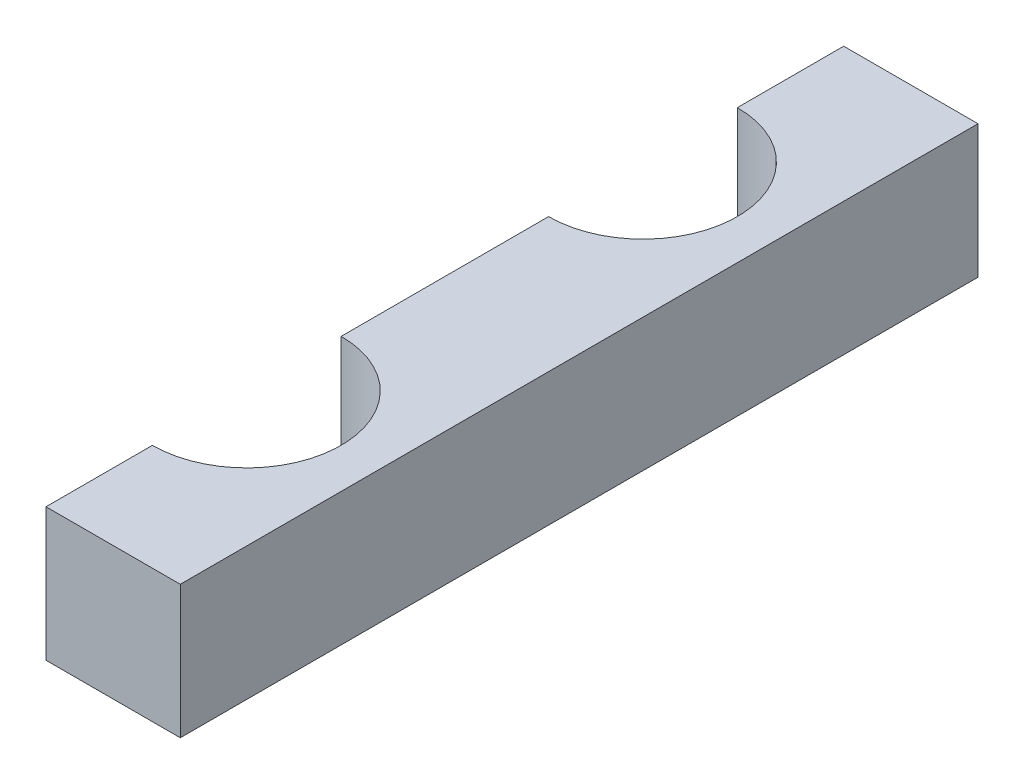
ISO-10303-21;
HEADER;
FILE_DESCRIPTION(('STEP AP214'),'2;1');
FILE_NAME('part.step','',(''),(''),'','','');
FILE_SCHEMA(('AUTOMOTIVE_DESIGN { 1 0 10303 214 1 1 1 1 }'));
ENDSEC;
DATA;
#1=APPLICATION_CONTEXT('core data for automotive mechanical design processes');
#2=APPLICATION_PROTOCOL_DEFINITION('international standard','automotive_design',2000,#1);
#3=PRODUCT_CONTEXT('',#1,'mechanical');
#4=PRODUCT('Part','Part','',(#3));
#5=PRODUCT_RELATED_PRODUCT_CATEGORY('part','',(#4));
#6=PRODUCT_DEFINITION_FORMATION('','',#4);
#7=PRODUCT_DEFINITION_CONTEXT('part definition',#1,'design');
#8=PRODUCT_DEFINITION('design','',#6,#7);
#9=PRODUCT_DEFINITION_SHAPE('','',#8);
#10=(LENGTH_UNIT() NAMED_UNIT(*) SI_UNIT(.MILLI.,.METRE.));
#11=(NAMED_UNIT(*) PLANE_ANGLE_UNIT() SI_UNIT($,.RADIAN.));
#12=(NAMED_UNIT(*) SI_UNIT($,.STERADIAN.) SOLID_ANGLE_UNIT());
#13=UNCERTAINTY_MEASURE_WITH_UNIT(LENGTH_MEASURE(1.E-05),#10,'distance_accuracy_value','');
#14=(GEOMETRIC_REPRESENTATION_CONTEXT(3) GLOBAL_UNCERTAINTY_ASSIGNED_CONTEXT((#13)) GLOBAL_UNIT_ASSIGNED_CONTEXT((#10,
#11,#12)) REPRESENTATION_CONTEXT('',''));
#15=CARTESIAN_POINT('',(0.,0.,0.));
#16=DIRECTION('',(0.,0.,1.));
#17=DIRECTION('',(1.,0.,0.));
#18=AXIS2_PLACEMENT_3D('',#15,#16,#17);
#19=CARTESIAN_POINT('',(3.56584894283638,372.645061039175,-110.773881836316));
#20=DIRECTION('',(0.,0.,-1.));
#21=DIRECTION('',(-1.,0.,0.));
#22=AXIS2_PLACEMENT_3D('',#19,#20,#21);
#23=PLANE('',#22);
#24=DIRECTION('',(-1.,0.,0.));
#25=VECTOR('',#24,1.);
#26=CARTESIAN_POINT('',(3.56584894283638,382.645061039175,-110.773881836316));
#27=LINE('',#26,#25);
#28=CARTESIAN_POINT('',(13.6658489428364,382.645061039175,-110.773881836316));
#29=VERTEX_POINT('',#28);
#30=CARTESIAN_POINT('',(3.56584894283638,382.645061039175,-110.773881836316));
#31=VERTEX_POINT('',#30);
#32=EDGE_CURVE('E131',#29,#31,#27,.T.);
#33=ORIENTED_EDGE('',*,*,#32,.F.);
#34=DIRECTION('',(0.,1.,0.));
#35=VECTOR('',#34,1.);
#36=CARTESIAN_POINT('',(13.6658489428364,372.645061039175,-110.773881836316));
#37=LINE('',#36,#35);
#38=CARTESIAN_POINT('',(13.6658489428364,372.645061039175,-110.773881836316));
#39=VERTEX_POINT('',#38);
#40=EDGE_CURVE('E11',#39,#29,#37,.T.);
#41=ORIENTED_EDGE('',*,*,#40,.F.);
#42=DIRECTION('',(-1.,0.,0.));
#43=VECTOR('',#42,1.);
#44=CARTESIAN_POINT('',(3.56584894283638,372.645061039175,-110.773881836316));
#45=LINE('',#44,#43);
#46=CARTESIAN_POINT('',(3.56584894283638,372.645061039175,-110.773881836316));
#47=VERTEX_POINT('',#46);
#48=EDGE_CURVE('E151',#39,#47,#45,.T.);
#49=ORIENTED_EDGE('',*,*,#48,.T.);
#50=DIRECTION('',(0.,1.,0.));
#51=VECTOR('',#50,1.);
#52=CARTESIAN_POINT('',(3.56584894283638,372.645061039175,-110.773881836316));
#53=LINE('',#52,#51);
#54=EDGE_CURVE('E37',#47,#31,#53,.T.);
#55=ORIENTED_EDGE('',*,*,#54,.T.);
#56=EDGE_LOOP('',(#33,#41,#49,#55));
#57=FACE_BOUND('',#56,.T.);
#58=ADVANCED_FACE('F34',(#57),#23,.T.);
#59=CARTESIAN_POINT('',(13.6658489428364,372.645061039175,-110.773881836316));
#60=DIRECTION('',(1.,0.,0.));
#61=DIRECTION('',(0.,0.,-1.));
#62=AXIS2_PLACEMENT_3D('',#59,#60,#61);
#63=PLANE('',#62);
#64=DIRECTION('',(0.,0.,-1.));
#65=VECTOR('',#64,1.);
#66=CARTESIAN_POINT('',(13.6658489428364,382.645061039175,-110.773881836316));
#67=LINE('',#66,#65);
#68=CARTESIAN_POINT('',(13.6658489428364,382.645061039175,-50.7738818363162));
#69=VERTEX_POINT('',#68);
#70=EDGE_CURVE('E149',#69,#29,#67,.T.);
#71=ORIENTED_EDGE('',*,*,#70,.F.);
#72=DIRECTION('',(0.,1.,0.));
#73=VECTOR('',#72,1.);
#74=CARTESIAN_POINT('',(13.6658489428364,372.645061039175,-50.7738818363162));
#75=LINE('',#74,#73);
#76=CARTESIAN_POINT('',(13.6658489428364,372.645061039175,-50.7738818363162));
#77=VERTEX_POINT('',#76);
#78=EDGE_CURVE('E43',#77,#69,#75,.T.);
#79=ORIENTED_EDGE('',*,*,#78,.F.);
#80=DIRECTION('',(0.,0.,-1.));
#81=VECTOR('',#80,1.);
#82=CARTESIAN_POINT('',(13.6658489428364,372.645061039175,-110.773881836316));
#83=LINE('',#82,#81);
#84=EDGE_CURVE('E121',#77,#39,#83,.T.);
#85=ORIENTED_EDGE('',*,*,#84,.T.);
#86=ORIENTED_EDGE('',*,*,#40,.T.);
#87=EDGE_LOOP('',(#71,#79,#85,#86));
#88=FACE_BOUND('',#87,.T.);
#89=ADVANCED_FACE('F163',(#88),#63,.T.);
#90=CARTESIAN_POINT('',(3.56584894283638,372.645061039175,-50.7738818363162));
#91=DIRECTION('',(0.,0.,1.));
#92=DIRECTION('',(1.,0.,0.));
#93=AXIS2_PLACEMENT_3D('',#90,#91,#92);
#94=PLANE('',#93);
#95=DIRECTION('',(1.,0.,0.));
#96=VECTOR('',#95,1.);
#97=CARTESIAN_POINT('',(3.56584894283638,382.645061039175,-50.7738818363162));
#98=LINE('',#97,#96);
#99=CARTESIAN_POINT('',(3.56584894283638,382.645061039175,-50.7738818363162));
#100=VERTEX_POINT('',#99);
#101=EDGE_CURVE('E108',#100,#69,#98,.T.);
#102=ORIENTED_EDGE('',*,*,#101,.F.);
#103=DIRECTION('',(0.,1.,0.));
#104=VECTOR('',#103,1.);
#105=CARTESIAN_POINT('',(3.56584894283638,372.645061039175,-50.7738818363162));
#106=LINE('',#105,#104);
#107=CARTESIAN_POINT('',(3.56584894283638,372.645061039175,-50.7738818363162));
#108=VERTEX_POINT('',#107);
#109=EDGE_CURVE('E103',#108,#100,#106,.T.);
#110=ORIENTED_EDGE('',*,*,#109,.F.);
#111=DIRECTION('',(1.,0.,0.));
#112=VECTOR('',#111,1.);
#113=CARTESIAN_POINT('',(3.56584894283638,372.645061039175,-50.7738818363162));
#114=LINE('',#113,#112);
#115=EDGE_CURVE('E106',#108,#77,#114,.T.);
#116=ORIENTED_EDGE('',*,*,#115,.T.);
#117=ORIENTED_EDGE('',*,*,#78,.T.);
#118=EDGE_LOOP('',(#102,#110,#116,#117));
#119=FACE_BOUND('',#118,.T.);
#120=ADVANCED_FACE('F105',(#119),#94,.T.);
#121=CARTESIAN_POINT('',(3.56584894283638,372.645061039175,-58.7738818363162));
#122=DIRECTION('',(-1.,0.,0.));
#123=DIRECTION('',(0.,0.,1.));
#124=AXIS2_PLACEMENT_3D('',#121,#122,#123);
#125=PLANE('',#124);
#126=DIRECTION('',(0.,0.,1.));
#127=VECTOR('',#126,1.);
#128=CARTESIAN_POINT('',(3.56584894283638,382.645061039175,-58.7738818363162));
#129=LINE('',#128,#127);
#130=CARTESIAN_POINT('',(3.56584894283638,382.645061039175,-58.7738818363162));
#131=VERTEX_POINT('',#130);
#132=EDGE_CURVE('E146',#131,#100,#129,.T.);
#133=ORIENTED_EDGE('',*,*,#132,.F.);
#134=DIRECTION('',(0.,1.,0.));
#135=VECTOR('',#134,1.);
#136=CARTESIAN_POINT('',(3.56584894283638,372.645061039175,-58.7738818363162));
#137=LINE('',#136,#135);
#138=CARTESIAN_POINT('',(3.56584894283638,372.645061039175,-58.7738818363162));
#139=VERTEX_POINT('',#138);
#140=EDGE_CURVE('E113',#139,#131,#137,.T.);
#141=ORIENTED_EDGE('',*,*,#140,.F.);
#142=DIRECTION('',(0.,0.,1.));
#143=VECTOR('',#142,1.);
#144=CARTESIAN_POINT('',(3.56584894283638,372.645061039175,-58.7738818363162));
#145=LINE('',#144,#143);
#146=EDGE_CURVE('E119',#139,#108,#145,.T.);
#147=ORIENTED_EDGE('',*,*,#146,.T.);
#148=ORIENTED_EDGE('',*,*,#109,.T.);
#149=EDGE_LOOP('',(#133,#141,#147,#148));
#150=FACE_BOUND('',#149,.T.);
#151=ADVANCED_FACE('F123',(#150),#125,.T.);
#152=CARTESIAN_POINT('',(3.56584894283638,372.645061039175,-65.8738818363162));
#153=DIRECTION('',(0.,1.,0.));
#154=DIRECTION('',(0.,0.,1.));
#155=AXIS2_PLACEMENT_3D('',#152,#153,#154);
#156=CYLINDRICAL_SURFACE('',#155,7.1);
#157=CARTESIAN_POINT('',(3.56584894283638,382.645061039175,-65.8738818363162));
#158=DIRECTION('',(0.,-1.,0.));
#159=DIRECTION('',(0.,0.,-1.));
#160=AXIS2_PLACEMENT_3D('',#157,#158,#159);
#161=CIRCLE('',#160,7.1);
#162=CARTESIAN_POINT('',(3.56584894283638,382.645061039175,-72.9738818363162));
#163=VERTEX_POINT('',#162);
#164=EDGE_CURVE('E143',#163,#131,#161,.T.);
#165=ORIENTED_EDGE('',*,*,#164,.F.);
#166=DIRECTION('',(0.,1.,0.));
#167=VECTOR('',#166,1.);
#168=CARTESIAN_POINT('',(3.56584894283638,372.645061039175,-72.9738818363162));
#169=LINE('',#168,#167);
#170=CARTESIAN_POINT('',(3.56584894283638,372.645061039175,-72.9738818363162));
#171=VERTEX_POINT('',#170);
#172=EDGE_CURVE('E155',#171,#163,#169,.T.);
#173=ORIENTED_EDGE('',*,*,#172,.F.);
#174=CARTESIAN_POINT('',(3.56584894283638,372.645061039175,-65.8738818363162));
#175=DIRECTION('',(0.,-1.,0.));
#176=DIRECTION('',(0.,0.,-1.));
#177=AXIS2_PLACEMENT_3D('',#174,#175,#176);
#178=CIRCLE('',#177,7.1);
#179=EDGE_CURVE('E124',#171,#139,#178,.T.);
#180=ORIENTED_EDGE('',*,*,#179,.T.);
#181=ORIENTED_EDGE('',*,*,#140,.T.);
#182=EDGE_LOOP('',(#165,#173,#180,#181));
#183=FACE_BOUND('',#182,.T.);
#184=ADVANCED_FACE('F176',(#183),#156,.F.);
#185=CARTESIAN_POINT('',(3.56584894283638,372.645061039175,-88.5738818363162));
#186=DIRECTION('',(-1.,0.,0.));
#187=DIRECTION('',(0.,0.,1.));
#188=AXIS2_PLACEMENT_3D('',#185,#186,#187);
#189=PLANE('',#188);
#190=DIRECTION('',(0.,0.,1.));
#191=VECTOR('',#190,1.);
#192=CARTESIAN_POINT('',(3.56584894283638,382.645061039175,-88.5738818363162));
#193=LINE('',#192,#191);
#194=CARTESIAN_POINT('',(3.56584894283638,382.645061039175,-88.5738818363162));
#195=VERTEX_POINT('',#194);
#196=EDGE_CURVE('E140',#195,#163,#193,.T.);
#197=ORIENTED_EDGE('',*,*,#196,.F.);
#198=DIRECTION('',(0.,1.,0.));
#199=VECTOR('',#198,1.);
#200=CARTESIAN_POINT('',(3.56584894283638,372.645061039175,-88.5738818363162));
#201=LINE('',#200,#199);
#202=CARTESIAN_POINT('',(3.56584894283638,372.645061039175,-88.5738818363162));
#203=VERTEX_POINT('',#202);
#204=EDGE_CURVE('E157',#203,#195,#201,.T.);
#205=ORIENTED_EDGE('',*,*,#204,.F.);
#206=DIRECTION('',(0.,0.,1.));
#207=VECTOR('',#206,1.);
#208=CARTESIAN_POINT('',(3.56584894283638,372.645061039175,-88.5738818363162));
#209=LINE('',#208,#207);
#210=EDGE_CURVE('E126',#203,#171,#209,.T.);
#211=ORIENTED_EDGE('',*,*,#210,.T.);
#212=ORIENTED_EDGE('',*,*,#172,.T.);
#213=EDGE_LOOP('',(#197,#205,#211,#212));
#214=FACE_BOUND('',#213,.T.);
#215=ADVANCED_FACE('F179',(#214),#189,.T.);
#216=CARTESIAN_POINT('',(3.56584894283638,372.645061039175,-95.6738818363162));
#217=DIRECTION('',(0.,1.,0.));
#218=DIRECTION('',(0.,0.,1.));
#219=AXIS2_PLACEMENT_3D('',#216,#217,#218);
#220=CYLINDRICAL_SURFACE('',#219,7.1);
#221=CARTESIAN_POINT('',(3.56584894283638,382.645061039175,-95.6738818363162));
#222=DIRECTION('',(0.,-1.,0.));
#223=DIRECTION('',(0.,0.,-1.));
#224=AXIS2_PLACEMENT_3D('',#221,#222,#223);
#225=CIRCLE('',#224,7.1);
#226=CARTESIAN_POINT('',(3.56584894283638,382.645061039175,-102.773881836316));
#227=VERTEX_POINT('',#226);
#228=EDGE_CURVE('E137',#227,#195,#225,.T.);
#229=ORIENTED_EDGE('',*,*,#228,.F.);
#230=DIRECTION('',(0.,1.,0.));
#231=VECTOR('',#230,1.);
#232=CARTESIAN_POINT('',(3.56584894283638,372.645061039175,-102.773881836316));
#233=LINE('',#232,#231);
#234=CARTESIAN_POINT('',(3.56584894283638,372.645061039175,-102.773881836316));
#235=VERTEX_POINT('',#234);
#236=EDGE_CURVE('E158',#235,#227,#233,.T.);
#237=ORIENTED_EDGE('',*,*,#236,.F.);
#238=CARTESIAN_POINT('',(3.56584894283638,372.645061039175,-95.6738818363162));
#239=DIRECTION('',(0.,-1.,0.));
#240=DIRECTION('',(0.,0.,-1.));
#241=AXIS2_PLACEMENT_3D('',#238,#239,#240);
#242=CIRCLE('',#241,7.1);
#243=EDGE_CURVE('E254',#235,#203,#242,.T.);
#244=ORIENTED_EDGE('',*,*,#243,.T.);
#245=ORIENTED_EDGE('',*,*,#204,.T.);
#246=EDGE_LOOP('',(#229,#237,#244,#245));
#247=FACE_BOUND('',#246,.T.);
#248=ADVANCED_FACE('F183',(#247),#220,.F.);
#249=CARTESIAN_POINT('',(3.56584894283638,372.645061039175,-102.773881836316));
#250=DIRECTION('',(-1.,0.,0.));
#251=DIRECTION('',(0.,0.,1.));
#252=AXIS2_PLACEMENT_3D('',#249,#250,#251);
#253=PLANE('',#252);
#254=DIRECTION('',(0.,0.,1.));
#255=VECTOR('',#254,1.);
#256=CARTESIAN_POINT('',(3.56584894283638,382.645061039175,-102.773881836316));
#257=LINE('',#256,#255);
#258=EDGE_CURVE('E134',#31,#227,#257,.T.);
#259=ORIENTED_EDGE('',*,*,#258,.F.);
#260=ORIENTED_EDGE('',*,*,#54,.F.);
#261=DIRECTION('',(0.,0.,1.));
#262=VECTOR('',#261,1.);
#263=CARTESIAN_POINT('',(3.56584894283638,372.645061039175,-102.773881836316));
#264=LINE('',#263,#262);
#265=EDGE_CURVE('E255',#47,#235,#264,.T.);
#266=ORIENTED_EDGE('',*,*,#265,.T.);
#267=ORIENTED_EDGE('',*,*,#236,.T.);
#268=EDGE_LOOP('',(#259,#260,#266,#267));
#269=FACE_BOUND('',#268,.T.);
#270=ADVANCED_FACE('F160',(#269),#253,.T.);
#271=CARTESIAN_POINT('',(3.56584894283638,372.645061039175,-65.8738818363162));
#272=DIRECTION('',(0.,-1.,0.));
#273=DIRECTION('',(0.,0.,-1.));
#274=AXIS2_PLACEMENT_3D('',#271,#272,#273);
#275=PLANE('',#274);
#276=ORIENTED_EDGE('',*,*,#48,.F.);
#277=ORIENTED_EDGE('',*,*,#84,.F.);
#278=ORIENTED_EDGE('',*,*,#115,.F.);
#279=ORIENTED_EDGE('',*,*,#146,.F.);
#280=ORIENTED_EDGE('',*,*,#179,.F.);
#281=ORIENTED_EDGE('',*,*,#210,.F.);
#282=ORIENTED_EDGE('',*,*,#243,.F.);
#283=ORIENTED_EDGE('',*,*,#265,.F.);
#284=EDGE_LOOP('',(#276,#277,#278,#279,#280,#281,#282,#283));
#285=FACE_BOUND('',#284,.T.);
#286=ADVANCED_FACE('F117',(#285),#275,.T.);
#287=CARTESIAN_POINT('',(3.56584894283638,382.645061039175,-65.8738818363162));
#288=DIRECTION('',(0.,-1.,0.));
#289=DIRECTION('',(0.,0.,-1.));
#290=AXIS2_PLACEMENT_3D('',#287,#288,#289);
#291=PLANE('',#290);
#292=ORIENTED_EDGE('',*,*,#32,.T.);
#293=ORIENTED_EDGE('',*,*,#258,.T.);
#294=ORIENTED_EDGE('',*,*,#228,.T.);
#295=ORIENTED_EDGE('',*,*,#196,.T.);
#296=ORIENTED_EDGE('',*,*,#164,.T.);
#297=ORIENTED_EDGE('',*,*,#132,.T.);
#298=ORIENTED_EDGE('',*,*,#101,.T.);
#299=ORIENTED_EDGE('',*,*,#70,.T.);
#300=EDGE_LOOP('',(#292,#293,#294,#295,#296,#297,#298,#299));
#301=FACE_BOUND('',#300,.T.);
#302=ADVANCED_FACE('F162',(#301),#291,.F.);
#303=CLOSED_SHELL('',(#58,#89,#120,#151,#184,#215,#248,#270,#286,#302));
#304=MANIFOLD_SOLID_BREP('B2',#303);
#305=ADVANCED_BREP_SHAPE_REPRESENTATION('',(#18,#304),#14);
#306=SHAPE_DEFINITION_REPRESENTATION(#9,#305);
ENDSEC;
END-ISO-10303-21;
